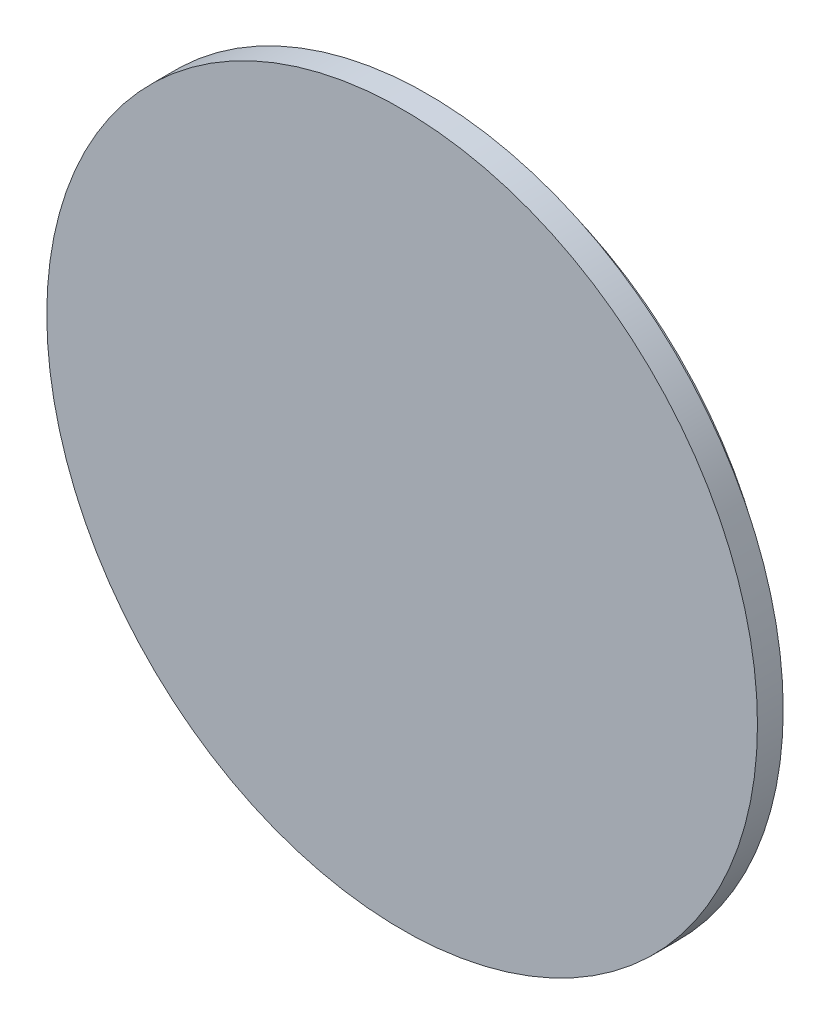
ISO-10303-21;
HEADER;
FILE_DESCRIPTION(('STEP AP214'),'2;1');
FILE_NAME('part.step','',(''),(''),'','','');
FILE_SCHEMA(('AUTOMOTIVE_DESIGN { 1 0 10303 214 1 1 1 1 }'));
ENDSEC;
DATA;
#1=APPLICATION_CONTEXT('core data for automotive mechanical design processes');
#2=APPLICATION_PROTOCOL_DEFINITION('international standard','automotive_design',2000,#1);
#3=PRODUCT_CONTEXT('',#1,'mechanical');
#4=PRODUCT('Part','Part','',(#3));
#5=PRODUCT_RELATED_PRODUCT_CATEGORY('part','',(#4));
#6=PRODUCT_DEFINITION_FORMATION('','',#4);
#7=PRODUCT_DEFINITION_CONTEXT('part definition',#1,'design');
#8=PRODUCT_DEFINITION('design','',#6,#7);
#9=PRODUCT_DEFINITION_SHAPE('','',#8);
#10=(LENGTH_UNIT() NAMED_UNIT(*) SI_UNIT(.MILLI.,.METRE.));
#11=(NAMED_UNIT(*) PLANE_ANGLE_UNIT() SI_UNIT($,.RADIAN.));
#12=(NAMED_UNIT(*) SI_UNIT($,.STERADIAN.) SOLID_ANGLE_UNIT());
#13=UNCERTAINTY_MEASURE_WITH_UNIT(LENGTH_MEASURE(1.E-05),#10,'distance_accuracy_value','');
#14=(GEOMETRIC_REPRESENTATION_CONTEXT(3) GLOBAL_UNCERTAINTY_ASSIGNED_CONTEXT((#13)) GLOBAL_UNIT_ASSIGNED_CONTEXT((#10,
#11,#12)) REPRESENTATION_CONTEXT('',''));
#15=CARTESIAN_POINT('',(0.,0.,0.));
#16=DIRECTION('',(0.,0.,1.));
#17=DIRECTION('',(1.,0.,0.));
#18=AXIS2_PLACEMENT_3D('',#15,#16,#17);
#19=CARTESIAN_POINT('',(0.,0.,0.));
#20=DIRECTION('',(0.,0.,1.));
#21=DIRECTION('',(1.,0.,0.));
#22=AXIS2_PLACEMENT_3D('',#19,#20,#21);
#23=PLANE('',#22);
#24=CARTESIAN_POINT('',(0.,0.,0.));
#25=DIRECTION('',(0.,0.,-1.));
#26=DIRECTION('',(-1.,0.,0.));
#27=AXIS2_PLACEMENT_3D('',#24,#25,#26);
#28=CIRCLE('',#27,31.85);
#29=CARTESIAN_POINT('',(-0.774999999975507,-31.8405696400055,0.));
#30=VERTEX_POINT('',#29);
#31=CARTESIAN_POINT('',(-31.8405696400049,-0.775000000000002,0.));
#32=VERTEX_POINT('',#31);
#33=EDGE_CURVE('E124',#30,#32,#28,.T.);
#34=ORIENTED_EDGE('',*,*,#33,.T.);
#35=DIRECTION('',(1.,0.,0.));
#36=VECTOR('',#35,1.);
#37=CARTESIAN_POINT('',(-34.5,-0.775000000000002,0.));
#38=LINE('',#37,#36);
#39=CARTESIAN_POINT('',(-0.774999999975511,-0.775000000000002,0.));
#40=VERTEX_POINT('',#39);
#41=EDGE_CURVE('E151',#32,#40,#38,.T.);
#42=ORIENTED_EDGE('',*,*,#41,.T.);
#43=DIRECTION('',(0.,-1.,0.));
#44=VECTOR('',#43,1.);
#45=CARTESIAN_POINT('',(-0.774999999975507,0.,0.));
#46=LINE('',#45,#44);
#47=EDGE_CURVE('E145',#40,#30,#46,.T.);
#48=ORIENTED_EDGE('',*,*,#47,.T.);
#49=EDGE_LOOP('',(#34,#42,#48));
#50=FACE_BOUND('',#49,.T.);
#51=ADVANCED_FACE('F36',(#50),#23,.F.);
#52=CARTESIAN_POINT('',(-0.774999999975507,-34.5,0.));
#53=DIRECTION('',(-1.,0.,0.));
#54=DIRECTION('',(0.,0.,1.));
#55=AXIS2_PLACEMENT_3D('',#52,#53,#54);
#56=PLANE('',#55);
#57=ORIENTED_EDGE('',*,*,#47,.F.);
#58=DIRECTION('',(0.,0.,1.));
#59=VECTOR('',#58,1.);
#60=CARTESIAN_POINT('',(-0.774999999975507,-0.775000000000005,0.));
#61=LINE('',#60,#59);
#62=CARTESIAN_POINT('',(-0.774999999975511,-0.775000000000002,1.5));
#63=VERTEX_POINT('',#62);
#64=EDGE_CURVE('E107',#40,#63,#61,.T.);
#65=ORIENTED_EDGE('',*,*,#64,.T.);
#66=DIRECTION('',(0.,1.,0.));
#67=VECTOR('',#66,1.);
#68=CARTESIAN_POINT('',(-0.774999999975507,-34.5,1.5));
#69=LINE('',#68,#67);
#70=CARTESIAN_POINT('',(-0.774999999975507,-31.8405696400055,1.5));
#71=VERTEX_POINT('',#70);
#72=EDGE_CURVE('E158',#71,#63,#69,.T.);
#73=ORIENTED_EDGE('',*,*,#72,.F.);
#74=DIRECTION('',(0.,0.,-1.));
#75=VECTOR('',#74,1.);
#76=CARTESIAN_POINT('',(-0.774999999975507,-31.8405696400055,0.));
#77=LINE('',#76,#75);
#78=EDGE_CURVE('E128',#71,#30,#77,.T.);
#79=ORIENTED_EDGE('',*,*,#78,.T.);
#80=EDGE_LOOP('',(#57,#65,#73,#79));
#81=FACE_BOUND('',#80,.T.);
#82=ADVANCED_FACE('F156',(#81),#56,.F.);
#83=CARTESIAN_POINT('',(-0.774999999975507,31.8405696400055,0.));
#84=VERTEX_POINT('',#83);
#85=CARTESIAN_POINT('',(-0.774999999975507,0.774999999999999,0.));
#86=VERTEX_POINT('',#85);
#87=EDGE_CURVE('E115',#84,#86,#46,.T.);
#88=ORIENTED_EDGE('',*,*,#87,.T.);
#89=DIRECTION('',(1.,0.,0.));
#90=VECTOR('',#89,1.);
#91=CARTESIAN_POINT('',(-34.5,0.774999999999998,0.));
#92=LINE('',#91,#90);
#93=CARTESIAN_POINT('',(-31.8405696400049,0.774999999999998,0.));
#94=VERTEX_POINT('',#93);
#95=EDGE_CURVE('E51',#94,#86,#92,.T.);
#96=ORIENTED_EDGE('',*,*,#95,.F.);
#97=EDGE_CURVE('E113',#94,#84,#28,.T.);
#98=ORIENTED_EDGE('',*,*,#97,.T.);
#99=EDGE_LOOP('',(#88,#96,#98));
#100=FACE_BOUND('',#99,.T.);
#101=ADVANCED_FACE('F112',(#100),#23,.F.);
#102=CARTESIAN_POINT('',(0.,0.,4.5));
#103=DIRECTION('',(0.,0.,-1.));
#104=DIRECTION('',(-1.,0.,0.));
#105=AXIS2_PLACEMENT_3D('',#102,#103,#104);
#106=CYLINDRICAL_SURFACE('',#105,34.5);
#107=CARTESIAN_POINT('',(0.,0.,4.5));
#108=DIRECTION('',(0.,0.,1.));
#109=DIRECTION('',(1.,0.,0.));
#110=AXIS2_PLACEMENT_3D('',#107,#108,#109);
#111=CIRCLE('',#110,34.5);
#112=CARTESIAN_POINT('',(34.5,0.,4.5));
#113=VERTEX_POINT('',#112);
#114=EDGE_CURVE('E139',#113,#113,#111,.T.);
#115=ORIENTED_EDGE('',*,*,#114,.F.);
#116=EDGE_LOOP('',(#115));
#117=FACE_BOUND('',#116,.T.);
#118=CARTESIAN_POINT('',(0.,0.,2.00000000000001));
#119=DIRECTION('',(0.,0.,-1.));
#120=DIRECTION('',(-1.,0.,0.));
#121=AXIS2_PLACEMENT_3D('',#118,#119,#120);
#122=CIRCLE('',#121,34.5);
#123=CARTESIAN_POINT('',(-34.5,0.,2.00000000000001));
#124=VERTEX_POINT('',#123);
#125=EDGE_CURVE('E136',#124,#124,#122,.T.);
#126=ORIENTED_EDGE('',*,*,#125,.F.);
#127=EDGE_LOOP('',(#126));
#128=FACE_BOUND('',#127,.T.);
#129=ADVANCED_FACE('F38',(#117,#128),#106,.T.);
#130=CARTESIAN_POINT('',(0.,0.,4.5));
#131=DIRECTION('',(0.,0.,1.));
#132=DIRECTION('',(1.,0.,0.));
#133=AXIS2_PLACEMENT_3D('',#130,#131,#132);
#134=PLANE('',#133);
#135=ORIENTED_EDGE('',*,*,#114,.T.);
#136=EDGE_LOOP('',(#135));
#137=FACE_BOUND('',#136,.T.);
#138=ADVANCED_FACE('F215',(#137),#134,.T.);
#139=CARTESIAN_POINT('',(34.5,0.,2.));
#140=DIRECTION('',(0.,0.,-1.));
#141=DIRECTION('',(-1.,0.,0.));
#142=AXIS2_PLACEMENT_3D('',#139,#140,#141);
#143=PLANE('',#142);
#144=ORIENTED_EDGE('',*,*,#125,.T.);
#145=EDGE_LOOP('',(#144));
#146=FACE_BOUND('',#145,.T.);
#147=CARTESIAN_POINT('',(0.,0.,2.00000000000001));
#148=DIRECTION('',(0.,0.,-1.));
#149=DIRECTION('',(-1.,0.,0.));
#150=AXIS2_PLACEMENT_3D('',#147,#148,#149);
#151=CIRCLE('',#150,31.85);
#152=CARTESIAN_POINT('',(-31.85,0.,2.00000000000001));
#153=VERTEX_POINT('',#152);
#154=EDGE_CURVE('E132',#153,#153,#151,.T.);
#155=ORIENTED_EDGE('',*,*,#154,.F.);
#156=EDGE_LOOP('',(#155));
#157=FACE_BOUND('',#156,.T.);
#158=ADVANCED_FACE('F210',(#146,#157),#143,.T.);
#159=CARTESIAN_POINT('',(0.,0.,0.));
#160=DIRECTION('',(0.,0.,-1.));
#161=DIRECTION('',(-1.,0.,0.));
#162=AXIS2_PLACEMENT_3D('',#159,#160,#161);
#163=CYLINDRICAL_SURFACE('',#162,31.85);
#164=DIRECTION('',(0.,0.,-1.));
#165=VECTOR('',#164,1.);
#166=CARTESIAN_POINT('',(-31.8405696400049,-0.775000000000002,0.));
#167=LINE('',#166,#165);
#168=CARTESIAN_POINT('',(-31.8405696400049,-0.775000000000002,1.5));
#169=VERTEX_POINT('',#168);
#170=EDGE_CURVE('E162',#32,#169,#167,.F.);
#171=ORIENTED_EDGE('',*,*,#170,.F.);
#172=ORIENTED_EDGE('',*,*,#33,.F.);
#173=ORIENTED_EDGE('',*,*,#78,.F.);
#174=CARTESIAN_POINT('',(0.,0.,1.5));
#175=DIRECTION('',(0.,0.,1.));
#176=DIRECTION('',(1.,0.,0.));
#177=AXIS2_PLACEMENT_3D('',#174,#175,#176);
#178=CIRCLE('',#177,31.85);
#179=CARTESIAN_POINT('',(0.775000000024493,-31.8405696400043,1.5));
#180=VERTEX_POINT('',#179);
#181=EDGE_CURVE('E11',#180,#71,#178,.F.);
#182=ORIENTED_EDGE('',*,*,#181,.F.);
#183=DIRECTION('',(0.,0.,-1.));
#184=VECTOR('',#183,1.);
#185=CARTESIAN_POINT('',(0.775000000024493,-31.8405696400043,0.));
#186=LINE('',#185,#184);
#187=CARTESIAN_POINT('',(0.775000000024493,-31.8405696400043,0.));
#188=VERTEX_POINT('',#187);
#189=EDGE_CURVE('E160',#188,#180,#186,.F.);
#190=ORIENTED_EDGE('',*,*,#189,.F.);
#191=CARTESIAN_POINT('',(0.775000000024493,31.8405696400043,0.));
#192=VERTEX_POINT('',#191);
#193=EDGE_CURVE('E126',#192,#188,#28,.T.);
#194=ORIENTED_EDGE('',*,*,#193,.F.);
#195=DIRECTION('',(0.,0.,-1.));
#196=VECTOR('',#195,1.);
#197=CARTESIAN_POINT('',(0.775000000024493,31.8405696400043,0.));
#198=LINE('',#197,#196);
#199=CARTESIAN_POINT('',(0.775000000024493,31.8405696400043,1.5));
#200=VERTEX_POINT('',#199);
#201=EDGE_CURVE('E59',#200,#192,#198,.T.);
#202=ORIENTED_EDGE('',*,*,#201,.F.);
#203=CARTESIAN_POINT('',(-0.774999999975507,31.8405696400055,1.5));
#204=VERTEX_POINT('',#203);
#205=EDGE_CURVE('E40',#204,#200,#178,.F.);
#206=ORIENTED_EDGE('',*,*,#205,.F.);
#207=DIRECTION('',(0.,0.,-1.));
#208=VECTOR('',#207,1.);
#209=CARTESIAN_POINT('',(-0.774999999975507,31.8405696400055,0.));
#210=LINE('',#209,#208);
#211=EDGE_CURVE('E123',#84,#204,#210,.F.);
#212=ORIENTED_EDGE('',*,*,#211,.F.);
#213=ORIENTED_EDGE('',*,*,#97,.F.);
#214=DIRECTION('',(0.,0.,-1.));
#215=VECTOR('',#214,1.);
#216=CARTESIAN_POINT('',(-31.8405696400049,0.774999999999998,0.));
#217=LINE('',#216,#215);
#218=CARTESIAN_POINT('',(-31.8405696400049,0.775,1.5));
#219=VERTEX_POINT('',#218);
#220=EDGE_CURVE('E100',#219,#94,#217,.T.);
#221=ORIENTED_EDGE('',*,*,#220,.F.);
#222=CARTESIAN_POINT('',(0.,0.,1.5));
#223=DIRECTION('',(0.,0.,1.));
#224=DIRECTION('',(0.,-1.,0.));
#225=AXIS2_PLACEMENT_3D('',#222,#223,#224);
#226=CIRCLE('',#225,31.85);
#227=EDGE_CURVE('E163',#169,#219,#226,.F.);
#228=ORIENTED_EDGE('',*,*,#227,.F.);
#229=EDGE_LOOP('',(#171,#172,#173,#182,#190,#194,#202,#206,#212,#213,#221,#228));
#230=FACE_BOUND('',#229,.T.);
#231=ORIENTED_EDGE('',*,*,#154,.T.);
#232=EDGE_LOOP('',(#231));
#233=FACE_BOUND('',#232,.T.);
#234=ADVANCED_FACE('F119',(#230,#233),#163,.T.);
#235=ORIENTED_EDGE('',*,*,#193,.T.);
#236=DIRECTION('',(0.,1.,0.));
#237=VECTOR('',#236,1.);
#238=CARTESIAN_POINT('',(0.775000000024493,0.,0.));
#239=LINE('',#238,#237);
#240=EDGE_CURVE('E144',#188,#192,#239,.T.);
#241=ORIENTED_EDGE('',*,*,#240,.T.);
#242=EDGE_LOOP('',(#235,#241));
#243=FACE_BOUND('',#242,.T.);
#244=ADVANCED_FACE('F198',(#243),#23,.F.);
#245=CARTESIAN_POINT('',(-0.774999999975511,0.775,1.5));
#246=VERTEX_POINT('',#245);
#247=EDGE_CURVE('E167',#246,#204,#69,.T.);
#248=ORIENTED_EDGE('',*,*,#247,.F.);
#249=DIRECTION('',(0.,0.,-1.));
#250=VECTOR('',#249,1.);
#251=CARTESIAN_POINT('',(-0.774999999975507,0.774999999999998,0.));
#252=LINE('',#251,#250);
#253=EDGE_CURVE('E108',#246,#86,#252,.T.);
#254=ORIENTED_EDGE('',*,*,#253,.T.);
#255=ORIENTED_EDGE('',*,*,#87,.F.);
#256=ORIENTED_EDGE('',*,*,#211,.T.);
#257=EDGE_LOOP('',(#248,#254,#255,#256));
#258=FACE_BOUND('',#257,.T.);
#259=ADVANCED_FACE('F182',(#258),#56,.F.);
#260=CARTESIAN_POINT('',(0.775000000024493,-34.5,0.));
#261=DIRECTION('',(1.,0.,0.));
#262=DIRECTION('',(0.,0.,-1.));
#263=AXIS2_PLACEMENT_3D('',#260,#261,#262);
#264=PLANE('',#263);
#265=ORIENTED_EDGE('',*,*,#189,.T.);
#266=DIRECTION('',(0.,1.,0.));
#267=VECTOR('',#266,1.);
#268=CARTESIAN_POINT('',(0.775000000024493,-34.5,1.5));
#269=LINE('',#268,#267);
#270=EDGE_CURVE('E171',#180,#200,#269,.T.);
#271=ORIENTED_EDGE('',*,*,#270,.T.);
#272=ORIENTED_EDGE('',*,*,#201,.T.);
#273=ORIENTED_EDGE('',*,*,#240,.F.);
#274=EDGE_LOOP('',(#265,#271,#272,#273));
#275=FACE_BOUND('',#274,.T.);
#276=ADVANCED_FACE('F177',(#275),#264,.F.);
#277=CARTESIAN_POINT('',(-0.774999999975507,-34.5,1.5));
#278=DIRECTION('',(0.,0.,1.));
#279=DIRECTION('',(1.,0.,0.));
#280=AXIS2_PLACEMENT_3D('',#277,#278,#279);
#281=PLANE('',#280);
#282=ORIENTED_EDGE('',*,*,#72,.T.);
#283=DIRECTION('',(1.,0.,0.));
#284=VECTOR('',#283,1.);
#285=CARTESIAN_POINT('',(-34.5,-0.775000000000002,1.5));
#286=LINE('',#285,#284);
#287=EDGE_CURVE('E184',#169,#63,#286,.T.);
#288=ORIENTED_EDGE('',*,*,#287,.F.);
#289=ORIENTED_EDGE('',*,*,#227,.T.);
#290=DIRECTION('',(1.,0.,0.));
#291=VECTOR('',#290,1.);
#292=CARTESIAN_POINT('',(-34.5,0.775,1.5));
#293=LINE('',#292,#291);
#294=EDGE_CURVE('E103',#219,#246,#293,.T.);
#295=ORIENTED_EDGE('',*,*,#294,.T.);
#296=ORIENTED_EDGE('',*,*,#247,.T.);
#297=ORIENTED_EDGE('',*,*,#205,.T.);
#298=ORIENTED_EDGE('',*,*,#270,.F.);
#299=ORIENTED_EDGE('',*,*,#181,.T.);
#300=EDGE_LOOP('',(#282,#288,#289,#295,#296,#297,#298,#299));
#301=FACE_BOUND('',#300,.T.);
#302=ADVANCED_FACE('F179',(#301),#281,.F.);
#303=CARTESIAN_POINT('',(-34.5,-0.775000000000002,0.));
#304=DIRECTION('',(0.,-1.,0.));
#305=DIRECTION('',(0.,0.,-1.));
#306=AXIS2_PLACEMENT_3D('',#303,#304,#305);
#307=PLANE('',#306);
#308=ORIENTED_EDGE('',*,*,#170,.T.);
#309=ORIENTED_EDGE('',*,*,#287,.T.);
#310=ORIENTED_EDGE('',*,*,#64,.F.);
#311=ORIENTED_EDGE('',*,*,#41,.F.);
#312=EDGE_LOOP('',(#308,#309,#310,#311));
#313=FACE_BOUND('',#312,.T.);
#314=ADVANCED_FACE('F188',(#313),#307,.F.);
#315=CARTESIAN_POINT('',(-34.5,0.774999999999998,0.));
#316=DIRECTION('',(0.,1.,0.));
#317=DIRECTION('',(0.,0.,1.));
#318=AXIS2_PLACEMENT_3D('',#315,#316,#317);
#319=PLANE('',#318);
#320=ORIENTED_EDGE('',*,*,#220,.T.);
#321=ORIENTED_EDGE('',*,*,#95,.T.);
#322=ORIENTED_EDGE('',*,*,#253,.F.);
#323=ORIENTED_EDGE('',*,*,#294,.F.);
#324=EDGE_LOOP('',(#320,#321,#322,#323));
#325=FACE_BOUND('',#324,.T.);
#326=ADVANCED_FACE('F101',(#325),#319,.F.);
#327=CLOSED_SHELL('',(#51,#82,#101,#129,#138,#158,#234,#244,#259,#276,#302,#314,#326));
#328=MANIFOLD_SOLID_BREP('B2',#327);
#329=ADVANCED_BREP_SHAPE_REPRESENTATION('',(#18,#328),#14);
#330=SHAPE_DEFINITION_REPRESENTATION(#9,#329);
ENDSEC;
END-ISO-10303-21;
